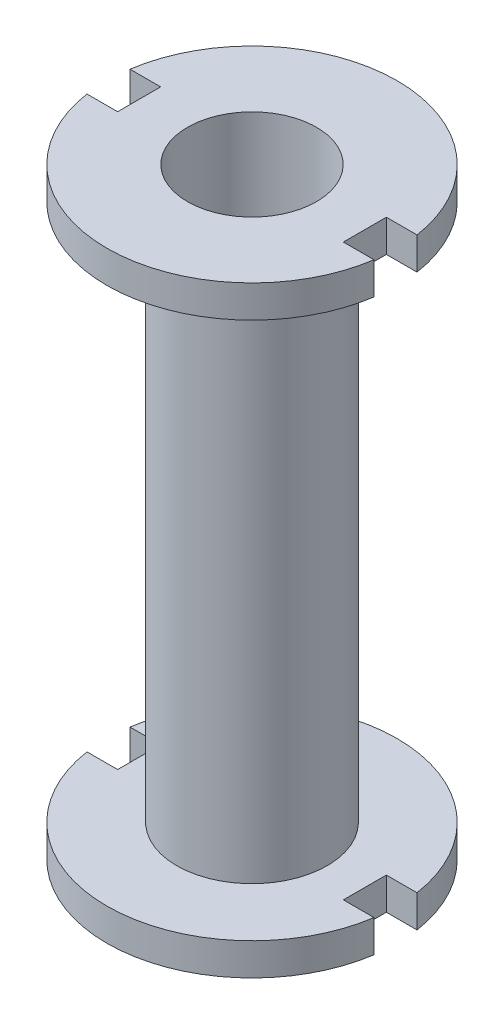
ISO-10303-21;
HEADER;
FILE_DESCRIPTION(('STEP AP214'),'2;1');
FILE_NAME('part.step','',(''),(''),'','','');
FILE_SCHEMA(('AUTOMOTIVE_DESIGN { 1 0 10303 214 1 1 1 1 }'));
ENDSEC;
DATA;
#1=APPLICATION_CONTEXT('core data for automotive mechanical design processes');
#2=APPLICATION_PROTOCOL_DEFINITION('international standard','automotive_design',2000,#1);
#3=PRODUCT_CONTEXT('',#1,'mechanical');
#4=PRODUCT('Part','Part','',(#3));
#5=PRODUCT_RELATED_PRODUCT_CATEGORY('part','',(#4));
#6=PRODUCT_DEFINITION_FORMATION('','',#4);
#7=PRODUCT_DEFINITION_CONTEXT('part definition',#1,'design');
#8=PRODUCT_DEFINITION('design','',#6,#7);
#9=PRODUCT_DEFINITION_SHAPE('','',#8);
#10=(LENGTH_UNIT() NAMED_UNIT(*) SI_UNIT(.MILLI.,.METRE.));
#11=(NAMED_UNIT(*) PLANE_ANGLE_UNIT() SI_UNIT($,.RADIAN.));
#12=(NAMED_UNIT(*) SI_UNIT($,.STERADIAN.) SOLID_ANGLE_UNIT());
#13=UNCERTAINTY_MEASURE_WITH_UNIT(LENGTH_MEASURE(1.E-05),#10,'distance_accuracy_value','');
#14=(GEOMETRIC_REPRESENTATION_CONTEXT(3) GLOBAL_UNCERTAINTY_ASSIGNED_CONTEXT((#13)) GLOBAL_UNIT_ASSIGNED_CONTEXT((#10,
#11,#12)) REPRESENTATION_CONTEXT('',''));
#15=CARTESIAN_POINT('',(0.,0.,0.));
#16=DIRECTION('',(0.,0.,1.));
#17=DIRECTION('',(1.,0.,0.));
#18=AXIS2_PLACEMENT_3D('',#15,#16,#17);
#19=CARTESIAN_POINT('',(0.,14.,0.));
#20=DIRECTION('',(0.,-1.,0.));
#21=DIRECTION('',(0.,0.,-1.));
#22=AXIS2_PLACEMENT_3D('',#19,#20,#21);
#23=CYLINDRICAL_SURFACE('',#22,6.75);
#24=CARTESIAN_POINT('',(0.,-12.5,0.));
#25=DIRECTION('',(0.,1.,0.));
#26=DIRECTION('',(0.,0.,1.));
#27=AXIS2_PLACEMENT_3D('',#24,#25,#26);
#28=CIRCLE('',#27,6.75);
#29=CARTESIAN_POINT('',(-6.67551496140934,-12.5,1.));
#30=VERTEX_POINT('',#29);
#31=CARTESIAN_POINT('',(6.67551496140934,-12.5,1.));
#32=VERTEX_POINT('',#31);
#33=EDGE_CURVE('E265',#30,#32,#28,.T.);
#34=ORIENTED_EDGE('',*,*,#33,.F.);
#35=DIRECTION('',(0.,-1.,0.));
#36=VECTOR('',#35,1.);
#37=CARTESIAN_POINT('',(-6.67551496140934,14.,1.));
#38=LINE('',#37,#36);
#39=CARTESIAN_POINT('',(-6.67551496140934,-14.,1.));
#40=VERTEX_POINT('',#39);
#41=EDGE_CURVE('E236',#30,#40,#38,.T.);
#42=ORIENTED_EDGE('',*,*,#41,.T.);
#43=CARTESIAN_POINT('',(0.,-14.,0.));
#44=DIRECTION('',(0.,1.,0.));
#45=DIRECTION('',(0.,0.,1.));
#46=AXIS2_PLACEMENT_3D('',#43,#44,#45);
#47=CIRCLE('',#46,6.75);
#48=CARTESIAN_POINT('',(6.67551496140934,-14.,1.));
#49=VERTEX_POINT('',#48);
#50=EDGE_CURVE('E250',#40,#49,#47,.T.);
#51=ORIENTED_EDGE('',*,*,#50,.T.);
#52=DIRECTION('',(0.,-1.,0.));
#53=VECTOR('',#52,1.);
#54=CARTESIAN_POINT('',(6.67551496140934,14.,1.));
#55=LINE('',#54,#53);
#56=EDGE_CURVE('E222',#49,#32,#55,.F.);
#57=ORIENTED_EDGE('',*,*,#56,.T.);
#58=EDGE_LOOP('',(#34,#42,#51,#57));
#59=FACE_BOUND('',#58,.T.);
#60=ADVANCED_FACE('F35',(#59),#23,.T.);
#61=CARTESIAN_POINT('',(0.,14.,0.));
#62=DIRECTION('',(0.,1.,0.));
#63=DIRECTION('',(0.,0.,1.));
#64=AXIS2_PLACEMENT_3D('',#61,#62,#63);
#65=CIRCLE('',#64,6.75);
#66=CARTESIAN_POINT('',(-6.67551496140934,14.,1.));
#67=VERTEX_POINT('',#66);
#68=CARTESIAN_POINT('',(6.67551496140934,14.,1.));
#69=VERTEX_POINT('',#68);
#70=EDGE_CURVE('E255',#67,#69,#65,.T.);
#71=ORIENTED_EDGE('',*,*,#70,.F.);
#72=DIRECTION('',(0.,-1.,0.));
#73=VECTOR('',#72,1.);
#74=CARTESIAN_POINT('',(-6.67551496140934,14.,1.));
#75=LINE('',#74,#73);
#76=CARTESIAN_POINT('',(-6.67551496140934,12.5,1.));
#77=VERTEX_POINT('',#76);
#78=EDGE_CURVE('E231',#67,#77,#75,.T.);
#79=ORIENTED_EDGE('',*,*,#78,.T.);
#80=CARTESIAN_POINT('',(0.,12.5,0.));
#81=DIRECTION('',(0.,1.,0.));
#82=DIRECTION('',(0.,0.,1.));
#83=AXIS2_PLACEMENT_3D('',#80,#81,#82);
#84=CIRCLE('',#83,6.75);
#85=CARTESIAN_POINT('',(6.67551496140934,12.5,1.));
#86=VERTEX_POINT('',#85);
#87=EDGE_CURVE('E244',#77,#86,#84,.T.);
#88=ORIENTED_EDGE('',*,*,#87,.T.);
#89=DIRECTION('',(0.,-1.,0.));
#90=VECTOR('',#89,1.);
#91=CARTESIAN_POINT('',(6.67551496140934,14.,1.));
#92=LINE('',#91,#90);
#93=EDGE_CURVE('E217',#86,#69,#92,.F.);
#94=ORIENTED_EDGE('',*,*,#93,.T.);
#95=EDGE_LOOP('',(#71,#79,#88,#94));
#96=FACE_BOUND('',#95,.T.);
#97=ADVANCED_FACE('F315',(#96),#23,.T.);
#98=CARTESIAN_POINT('',(6.67551496140934,-14.,-1.));
#99=VERTEX_POINT('',#98);
#100=CARTESIAN_POINT('',(-6.67551496140934,-14.,-1.));
#101=VERTEX_POINT('',#100);
#102=EDGE_CURVE('E259',#99,#101,#47,.T.);
#103=ORIENTED_EDGE('',*,*,#102,.T.);
#104=DIRECTION('',(0.,-1.,0.));
#105=VECTOR('',#104,1.);
#106=CARTESIAN_POINT('',(-6.67551496140934,14.,-1.));
#107=LINE('',#106,#105);
#108=CARTESIAN_POINT('',(-6.67551496140934,-12.5,-1.));
#109=VERTEX_POINT('',#108);
#110=EDGE_CURVE('E162',#101,#109,#107,.F.);
#111=ORIENTED_EDGE('',*,*,#110,.T.);
#112=CARTESIAN_POINT('',(6.67551496140934,-12.5,-1.));
#113=VERTEX_POINT('',#112);
#114=EDGE_CURVE('E254',#113,#109,#28,.T.);
#115=ORIENTED_EDGE('',*,*,#114,.F.);
#116=DIRECTION('',(0.,-1.,0.));
#117=VECTOR('',#116,1.);
#118=CARTESIAN_POINT('',(6.67551496140934,14.,-1.));
#119=LINE('',#118,#117);
#120=EDGE_CURVE('E58',#113,#99,#119,.T.);
#121=ORIENTED_EDGE('',*,*,#120,.T.);
#122=EDGE_LOOP('',(#103,#111,#115,#121));
#123=FACE_BOUND('',#122,.T.);
#124=ADVANCED_FACE('F317',(#123),#23,.T.);
#125=CARTESIAN_POINT('',(0.,14.,0.));
#126=DIRECTION('',(0.,1.,0.));
#127=DIRECTION('',(0.,0.,1.));
#128=AXIS2_PLACEMENT_3D('',#125,#126,#127);
#129=PLANE('',#128);
#130=DIRECTION('',(1.,0.,0.));
#131=VECTOR('',#130,1.);
#132=CARTESIAN_POINT('',(-8.25,14.,1.));
#133=LINE('',#132,#131);
#134=CARTESIAN_POINT('',(-5.25,14.,1.));
#135=VERTEX_POINT('',#134);
#136=EDGE_CURVE('E171',#67,#135,#133,.T.);
#137=ORIENTED_EDGE('',*,*,#136,.F.);
#138=ORIENTED_EDGE('',*,*,#70,.T.);
#139=DIRECTION('',(1.,0.,0.));
#140=VECTOR('',#139,1.);
#141=CARTESIAN_POINT('',(5.25,14.,1.));
#142=LINE('',#141,#140);
#143=CARTESIAN_POINT('',(5.25,14.,1.));
#144=VERTEX_POINT('',#143);
#145=EDGE_CURVE('E190',#144,#69,#142,.T.);
#146=ORIENTED_EDGE('',*,*,#145,.F.);
#147=DIRECTION('',(0.,0.,1.));
#148=VECTOR('',#147,1.);
#149=CARTESIAN_POINT('',(5.25,14.,-1.));
#150=LINE('',#149,#148);
#151=CARTESIAN_POINT('',(5.25,14.,-1.));
#152=VERTEX_POINT('',#151);
#153=EDGE_CURVE('E200',#152,#144,#150,.T.);
#154=ORIENTED_EDGE('',*,*,#153,.F.);
#155=DIRECTION('',(-1.,0.,0.));
#156=VECTOR('',#155,1.);
#157=CARTESIAN_POINT('',(5.25,14.,-1.));
#158=LINE('',#157,#156);
#159=CARTESIAN_POINT('',(6.67551496140934,14.,-1.));
#160=VERTEX_POINT('',#159);
#161=EDGE_CURVE('E197',#160,#152,#158,.T.);
#162=ORIENTED_EDGE('',*,*,#161,.F.);
#163=CARTESIAN_POINT('',(-6.67551496140934,14.,-1.));
#164=VERTEX_POINT('',#163);
#165=EDGE_CURVE('E258',#160,#164,#65,.T.);
#166=ORIENTED_EDGE('',*,*,#165,.T.);
#167=DIRECTION('',(-1.,0.,0.));
#168=VECTOR('',#167,1.);
#169=CARTESIAN_POINT('',(-8.25,14.,-1.));
#170=LINE('',#169,#168);
#171=CARTESIAN_POINT('',(-5.25,14.,-1.));
#172=VERTEX_POINT('',#171);
#173=EDGE_CURVE('E174',#172,#164,#170,.T.);
#174=ORIENTED_EDGE('',*,*,#173,.F.);
#175=DIRECTION('',(0.,0.,-1.));
#176=VECTOR('',#175,1.);
#177=CARTESIAN_POINT('',(-5.25,14.,-1.));
#178=LINE('',#177,#176);
#179=EDGE_CURVE('E178',#135,#172,#178,.T.);
#180=ORIENTED_EDGE('',*,*,#179,.F.);
#181=EDGE_LOOP('',(#137,#138,#146,#154,#162,#166,#174,#180));
#182=FACE_BOUND('',#181,.T.);
#183=CARTESIAN_POINT('',(0.,14.,0.));
#184=DIRECTION('',(0.,1.,0.));
#185=DIRECTION('',(0.,0.,1.));
#186=AXIS2_PLACEMENT_3D('',#183,#184,#185);
#187=CIRCLE('',#186,3.);
#188=CARTESIAN_POINT('',(0.,14.,3.));
#189=VERTEX_POINT('',#188);
#190=EDGE_CURVE('E247',#189,#189,#187,.T.);
#191=ORIENTED_EDGE('',*,*,#190,.F.);
#192=EDGE_LOOP('',(#191));
#193=FACE_BOUND('',#192,.T.);
#194=ADVANCED_FACE('F296',(#182,#193),#129,.T.);
#195=CARTESIAN_POINT('',(0.,-14.,0.));
#196=DIRECTION('',(0.,1.,0.));
#197=DIRECTION('',(0.,0.,1.));
#198=AXIS2_PLACEMENT_3D('',#195,#196,#197);
#199=PLANE('',#198);
#200=ORIENTED_EDGE('',*,*,#50,.F.);
#201=DIRECTION('',(1.,0.,0.));
#202=VECTOR('',#201,1.);
#203=CARTESIAN_POINT('',(-8.25,-14.,1.));
#204=LINE('',#203,#202);
#205=CARTESIAN_POINT('',(-5.25,-14.,1.));
#206=VERTEX_POINT('',#205);
#207=EDGE_CURVE('E166',#40,#206,#204,.T.);
#208=ORIENTED_EDGE('',*,*,#207,.T.);
#209=DIRECTION('',(0.,0.,-1.));
#210=VECTOR('',#209,1.);
#211=CARTESIAN_POINT('',(-5.25,-14.,-1.));
#212=LINE('',#211,#210);
#213=CARTESIAN_POINT('',(-5.25,-14.,-1.));
#214=VERTEX_POINT('',#213);
#215=EDGE_CURVE('E150',#206,#214,#212,.T.);
#216=ORIENTED_EDGE('',*,*,#215,.T.);
#217=DIRECTION('',(-1.,0.,0.));
#218=VECTOR('',#217,1.);
#219=CARTESIAN_POINT('',(-8.25,-14.,-1.));
#220=LINE('',#219,#218);
#221=EDGE_CURVE('E159',#214,#101,#220,.T.);
#222=ORIENTED_EDGE('',*,*,#221,.T.);
#223=ORIENTED_EDGE('',*,*,#102,.F.);
#224=DIRECTION('',(-1.,0.,0.));
#225=VECTOR('',#224,1.);
#226=CARTESIAN_POINT('',(5.25,-14.,-1.));
#227=LINE('',#226,#225);
#228=CARTESIAN_POINT('',(5.25,-14.,-1.));
#229=VERTEX_POINT('',#228);
#230=EDGE_CURVE('E186',#99,#229,#227,.T.);
#231=ORIENTED_EDGE('',*,*,#230,.T.);
#232=DIRECTION('',(0.,0.,1.));
#233=VECTOR('',#232,1.);
#234=CARTESIAN_POINT('',(5.25,-14.,-1.));
#235=LINE('',#234,#233);
#236=CARTESIAN_POINT('',(5.25,-14.,1.));
#237=VERTEX_POINT('',#236);
#238=EDGE_CURVE('E189',#229,#237,#235,.T.);
#239=ORIENTED_EDGE('',*,*,#238,.T.);
#240=DIRECTION('',(1.,0.,0.));
#241=VECTOR('',#240,1.);
#242=CARTESIAN_POINT('',(5.25,-14.,1.));
#243=LINE('',#242,#241);
#244=EDGE_CURVE('E193',#237,#49,#243,.T.);
#245=ORIENTED_EDGE('',*,*,#244,.T.);
#246=EDGE_LOOP('',(#200,#208,#216,#222,#223,#231,#239,#245));
#247=FACE_BOUND('',#246,.T.);
#248=CARTESIAN_POINT('',(0.,-14.,0.));
#249=DIRECTION('',(0.,1.,0.));
#250=DIRECTION('',(0.,0.,1.));
#251=AXIS2_PLACEMENT_3D('',#248,#249,#250);
#252=CIRCLE('',#251,3.);
#253=CARTESIAN_POINT('',(0.,-14.,3.));
#254=VERTEX_POINT('',#253);
#255=EDGE_CURVE('E251',#254,#254,#252,.T.);
#256=ORIENTED_EDGE('',*,*,#255,.T.);
#257=EDGE_LOOP('',(#256));
#258=FACE_BOUND('',#257,.T.);
#259=ADVANCED_FACE('F169',(#247,#258),#199,.F.);
#260=CARTESIAN_POINT('',(6.67551496140934,12.5,-1.));
#261=VERTEX_POINT('',#260);
#262=CARTESIAN_POINT('',(-6.67551496140934,12.5,-1.));
#263=VERTEX_POINT('',#262);
#264=EDGE_CURVE('E264',#261,#263,#84,.T.);
#265=ORIENTED_EDGE('',*,*,#264,.T.);
#266=DIRECTION('',(0.,-1.,0.));
#267=VECTOR('',#266,1.);
#268=CARTESIAN_POINT('',(-6.67551496140934,14.,-1.));
#269=LINE('',#268,#267);
#270=EDGE_CURVE('E225',#263,#164,#269,.F.);
#271=ORIENTED_EDGE('',*,*,#270,.T.);
#272=ORIENTED_EDGE('',*,*,#165,.F.);
#273=DIRECTION('',(0.,-1.,0.));
#274=VECTOR('',#273,1.);
#275=CARTESIAN_POINT('',(6.67551496140934,14.,-1.));
#276=LINE('',#275,#274);
#277=EDGE_CURVE('E184',#160,#261,#276,.T.);
#278=ORIENTED_EDGE('',*,*,#277,.T.);
#279=EDGE_LOOP('',(#265,#271,#272,#278));
#280=FACE_BOUND('',#279,.T.);
#281=ADVANCED_FACE('F37',(#280),#23,.T.);
#282=CARTESIAN_POINT('',(0.,14.,0.));
#283=DIRECTION('',(0.,-1.,0.));
#284=DIRECTION('',(0.,0.,-1.));
#285=AXIS2_PLACEMENT_3D('',#282,#283,#284);
#286=CYLINDRICAL_SURFACE('',#285,3.);
#287=ORIENTED_EDGE('',*,*,#190,.T.);
#288=EDGE_LOOP('',(#287));
#289=FACE_BOUND('',#288,.T.);
#290=ORIENTED_EDGE('',*,*,#255,.F.);
#291=EDGE_LOOP('',(#290));
#292=FACE_BOUND('',#291,.T.);
#293=ADVANCED_FACE('F328',(#289,#292),#286,.F.);
#294=CARTESIAN_POINT('',(0.,-12.5,0.));
#295=DIRECTION('',(0.,1.,0.));
#296=DIRECTION('',(0.,0.,1.));
#297=AXIS2_PLACEMENT_3D('',#294,#295,#296);
#298=PLANE('',#297);
#299=DIRECTION('',(1.,0.,0.));
#300=VECTOR('',#299,1.);
#301=CARTESIAN_POINT('',(0.,-12.5,1.));
#302=LINE('',#301,#300);
#303=CARTESIAN_POINT('',(-5.25,-12.5,1.));
#304=VERTEX_POINT('',#303);
#305=EDGE_CURVE('E234',#30,#304,#302,.T.);
#306=ORIENTED_EDGE('',*,*,#305,.F.);
#307=ORIENTED_EDGE('',*,*,#33,.T.);
#308=DIRECTION('',(1.,0.,0.));
#309=VECTOR('',#308,1.);
#310=CARTESIAN_POINT('',(0.,-12.5,1.));
#311=LINE('',#310,#309);
#312=CARTESIAN_POINT('',(5.25,-12.5,1.));
#313=VERTEX_POINT('',#312);
#314=EDGE_CURVE('E220',#313,#32,#311,.T.);
#315=ORIENTED_EDGE('',*,*,#314,.F.);
#316=DIRECTION('',(0.,0.,1.));
#317=VECTOR('',#316,1.);
#318=CARTESIAN_POINT('',(5.25,-12.5,0.));
#319=LINE('',#318,#317);
#320=CARTESIAN_POINT('',(5.25,-12.5,-1.));
#321=VERTEX_POINT('',#320);
#322=EDGE_CURVE('E215',#321,#313,#319,.T.);
#323=ORIENTED_EDGE('',*,*,#322,.F.);
#324=DIRECTION('',(-1.,0.,0.));
#325=VECTOR('',#324,1.);
#326=CARTESIAN_POINT('',(0.,-12.5,-1.));
#327=LINE('',#326,#325);
#328=EDGE_CURVE('E212',#113,#321,#327,.T.);
#329=ORIENTED_EDGE('',*,*,#328,.F.);
#330=ORIENTED_EDGE('',*,*,#114,.T.);
#331=DIRECTION('',(-1.,0.,0.));
#332=VECTOR('',#331,1.);
#333=CARTESIAN_POINT('',(0.,-12.5,-1.));
#334=LINE('',#333,#332);
#335=CARTESIAN_POINT('',(-5.25,-12.5,-1.));
#336=VERTEX_POINT('',#335);
#337=EDGE_CURVE('E228',#336,#109,#334,.T.);
#338=ORIENTED_EDGE('',*,*,#337,.F.);
#339=DIRECTION('',(0.,0.,-1.));
#340=VECTOR('',#339,1.);
#341=CARTESIAN_POINT('',(-5.25,-12.5,0.));
#342=LINE('',#341,#340);
#343=EDGE_CURVE('E153',#304,#336,#342,.T.);
#344=ORIENTED_EDGE('',*,*,#343,.F.);
#345=EDGE_LOOP('',(#306,#307,#315,#323,#329,#330,#338,#344));
#346=FACE_BOUND('',#345,.T.);
#347=CARTESIAN_POINT('',(0.,-12.5,0.));
#348=DIRECTION('',(0.,1.,0.));
#349=DIRECTION('',(0.,0.,1.));
#350=AXIS2_PLACEMENT_3D('',#347,#348,#349);
#351=CIRCLE('',#350,3.5);
#352=CARTESIAN_POINT('',(0.,-12.5,3.5));
#353=VERTEX_POINT('',#352);
#354=EDGE_CURVE('E241',#353,#353,#351,.T.);
#355=ORIENTED_EDGE('',*,*,#354,.F.);
#356=EDGE_LOOP('',(#355));
#357=FACE_BOUND('',#356,.T.);
#358=ADVANCED_FACE('F333',(#346,#357),#298,.T.);
#359=CARTESIAN_POINT('',(0.,12.5,0.));
#360=DIRECTION('',(0.,1.,0.));
#361=DIRECTION('',(0.,0.,1.));
#362=AXIS2_PLACEMENT_3D('',#359,#360,#361);
#363=PLANE('',#362);
#364=CARTESIAN_POINT('',(0.,12.5,0.));
#365=DIRECTION('',(0.,1.,0.));
#366=DIRECTION('',(0.,0.,1.));
#367=AXIS2_PLACEMENT_3D('',#364,#365,#366);
#368=CIRCLE('',#367,3.5);
#369=CARTESIAN_POINT('',(0.,12.5,3.5));
#370=VERTEX_POINT('',#369);
#371=EDGE_CURVE('E240',#370,#370,#368,.T.);
#372=ORIENTED_EDGE('',*,*,#371,.T.);
#373=EDGE_LOOP('',(#372));
#374=FACE_BOUND('',#373,.T.);
#375=ORIENTED_EDGE('',*,*,#87,.F.);
#376=DIRECTION('',(1.,0.,0.));
#377=VECTOR('',#376,1.);
#378=CARTESIAN_POINT('',(0.,12.5,1.));
#379=LINE('',#378,#377);
#380=CARTESIAN_POINT('',(-5.25,12.5,1.));
#381=VERTEX_POINT('',#380);
#382=EDGE_CURVE('E11',#77,#381,#379,.T.);
#383=ORIENTED_EDGE('',*,*,#382,.T.);
#384=DIRECTION('',(0.,0.,-1.));
#385=VECTOR('',#384,1.);
#386=CARTESIAN_POINT('',(-5.25,12.5,0.));
#387=LINE('',#386,#385);
#388=CARTESIAN_POINT('',(-5.25,12.5,-1.));
#389=VERTEX_POINT('',#388);
#390=EDGE_CURVE('E43',#381,#389,#387,.T.);
#391=ORIENTED_EDGE('',*,*,#390,.T.);
#392=DIRECTION('',(-1.,0.,0.));
#393=VECTOR('',#392,1.);
#394=CARTESIAN_POINT('',(0.,12.5,-1.));
#395=LINE('',#394,#393);
#396=EDGE_CURVE('E277',#389,#263,#395,.T.);
#397=ORIENTED_EDGE('',*,*,#396,.T.);
#398=ORIENTED_EDGE('',*,*,#264,.F.);
#399=DIRECTION('',(-1.,0.,0.));
#400=VECTOR('',#399,1.);
#401=CARTESIAN_POINT('',(0.,12.5,-1.));
#402=LINE('',#401,#400);
#403=CARTESIAN_POINT('',(5.25,12.5,-1.));
#404=VERTEX_POINT('',#403);
#405=EDGE_CURVE('E268',#261,#404,#402,.T.);
#406=ORIENTED_EDGE('',*,*,#405,.T.);
#407=DIRECTION('',(0.,0.,1.));
#408=VECTOR('',#407,1.);
#409=CARTESIAN_POINT('',(5.25,12.5,0.));
#410=LINE('',#409,#408);
#411=CARTESIAN_POINT('',(5.25,12.5,1.));
#412=VERTEX_POINT('',#411);
#413=EDGE_CURVE('E271',#404,#412,#410,.T.);
#414=ORIENTED_EDGE('',*,*,#413,.T.);
#415=DIRECTION('',(1.,0.,0.));
#416=VECTOR('',#415,1.);
#417=CARTESIAN_POINT('',(0.,12.5,1.));
#418=LINE('',#417,#416);
#419=EDGE_CURVE('E274',#412,#86,#418,.T.);
#420=ORIENTED_EDGE('',*,*,#419,.T.);
#421=EDGE_LOOP('',(#375,#383,#391,#397,#398,#406,#414,#420));
#422=FACE_BOUND('',#421,.T.);
#423=ADVANCED_FACE('F282',(#374,#422),#363,.F.);
#424=CARTESIAN_POINT('',(0.,-12.5,0.));
#425=DIRECTION('',(0.,1.,0.));
#426=DIRECTION('',(0.,0.,1.));
#427=AXIS2_PLACEMENT_3D('',#424,#425,#426);
#428=CYLINDRICAL_SURFACE('',#427,3.5);
#429=ORIENTED_EDGE('',*,*,#354,.T.);
#430=EDGE_LOOP('',(#429));
#431=FACE_BOUND('',#430,.T.);
#432=ORIENTED_EDGE('',*,*,#371,.F.);
#433=EDGE_LOOP('',(#432));
#434=FACE_BOUND('',#433,.T.);
#435=ADVANCED_FACE('F343',(#431,#434),#428,.T.);
#436=CARTESIAN_POINT('',(5.25,-14.,-1.));
#437=DIRECTION('',(0.,0.,-1.));
#438=DIRECTION('',(-1.,0.,0.));
#439=AXIS2_PLACEMENT_3D('',#436,#437,#438);
#440=PLANE('',#439);
#441=ORIENTED_EDGE('',*,*,#161,.T.);
#442=DIRECTION('',(0.,1.,0.));
#443=VECTOR('',#442,1.);
#444=CARTESIAN_POINT('',(5.25,-14.,-1.));
#445=LINE('',#444,#443);
#446=EDGE_CURVE('E196',#404,#152,#445,.T.);
#447=ORIENTED_EDGE('',*,*,#446,.F.);
#448=ORIENTED_EDGE('',*,*,#405,.F.);
#449=ORIENTED_EDGE('',*,*,#277,.F.);
#450=EDGE_LOOP('',(#441,#447,#448,#449));
#451=FACE_BOUND('',#450,.T.);
#452=ADVANCED_FACE('F306',(#451),#440,.F.);
#453=CARTESIAN_POINT('',(5.25,-14.,-1.));
#454=DIRECTION('',(-1.,0.,0.));
#455=DIRECTION('',(0.,0.,1.));
#456=AXIS2_PLACEMENT_3D('',#453,#454,#455);
#457=PLANE('',#456);
#458=ORIENTED_EDGE('',*,*,#446,.T.);
#459=ORIENTED_EDGE('',*,*,#153,.T.);
#460=DIRECTION('',(0.,1.,0.));
#461=VECTOR('',#460,1.);
#462=CARTESIAN_POINT('',(5.25,-14.,1.));
#463=LINE('',#462,#461);
#464=EDGE_CURVE('E206',#412,#144,#463,.T.);
#465=ORIENTED_EDGE('',*,*,#464,.F.);
#466=ORIENTED_EDGE('',*,*,#413,.F.);
#467=EDGE_LOOP('',(#458,#459,#465,#466));
#468=FACE_BOUND('',#467,.T.);
#469=ADVANCED_FACE('F310',(#468),#457,.F.);
#470=CARTESIAN_POINT('',(5.25,-14.,1.));
#471=DIRECTION('',(0.,0.,1.));
#472=DIRECTION('',(1.,0.,0.));
#473=AXIS2_PLACEMENT_3D('',#470,#471,#472);
#474=PLANE('',#473);
#475=ORIENTED_EDGE('',*,*,#419,.F.);
#476=ORIENTED_EDGE('',*,*,#464,.T.);
#477=ORIENTED_EDGE('',*,*,#145,.T.);
#478=ORIENTED_EDGE('',*,*,#93,.F.);
#479=EDGE_LOOP('',(#475,#476,#477,#478));
#480=FACE_BOUND('',#479,.T.);
#481=ADVANCED_FACE('F313',(#480),#474,.F.);
#482=CARTESIAN_POINT('',(-8.25,-14.,-1.));
#483=DIRECTION('',(0.,0.,-1.));
#484=DIRECTION('',(-1.,0.,0.));
#485=AXIS2_PLACEMENT_3D('',#482,#483,#484);
#486=PLANE('',#485);
#487=ORIENTED_EDGE('',*,*,#396,.F.);
#488=DIRECTION('',(0.,1.,0.));
#489=VECTOR('',#488,1.);
#490=CARTESIAN_POINT('',(-5.25,-14.,-1.));
#491=LINE('',#490,#489);
#492=EDGE_CURVE('E156',#389,#172,#491,.T.);
#493=ORIENTED_EDGE('',*,*,#492,.T.);
#494=ORIENTED_EDGE('',*,*,#173,.T.);
#495=ORIENTED_EDGE('',*,*,#270,.F.);
#496=EDGE_LOOP('',(#487,#493,#494,#495));
#497=FACE_BOUND('',#496,.T.);
#498=ADVANCED_FACE('F302',(#497),#486,.F.);
#499=CARTESIAN_POINT('',(-8.25,-14.,1.));
#500=DIRECTION('',(0.,0.,1.));
#501=DIRECTION('',(1.,0.,0.));
#502=AXIS2_PLACEMENT_3D('',#499,#500,#501);
#503=PLANE('',#502);
#504=ORIENTED_EDGE('',*,*,#136,.T.);
#505=DIRECTION('',(0.,1.,0.));
#506=VECTOR('',#505,1.);
#507=CARTESIAN_POINT('',(-5.25,-14.,1.));
#508=LINE('',#507,#506);
#509=EDGE_CURVE('E155',#381,#135,#508,.T.);
#510=ORIENTED_EDGE('',*,*,#509,.F.);
#511=ORIENTED_EDGE('',*,*,#382,.F.);
#512=ORIENTED_EDGE('',*,*,#78,.F.);
#513=EDGE_LOOP('',(#504,#510,#511,#512));
#514=FACE_BOUND('',#513,.T.);
#515=ADVANCED_FACE('F290',(#514),#503,.F.);
#516=CARTESIAN_POINT('',(-5.25,-14.,-1.));
#517=DIRECTION('',(1.,0.,0.));
#518=DIRECTION('',(0.,0.,-1.));
#519=AXIS2_PLACEMENT_3D('',#516,#517,#518);
#520=PLANE('',#519);
#521=ORIENTED_EDGE('',*,*,#509,.T.);
#522=ORIENTED_EDGE('',*,*,#179,.T.);
#523=ORIENTED_EDGE('',*,*,#492,.F.);
#524=ORIENTED_EDGE('',*,*,#390,.F.);
#525=EDGE_LOOP('',(#521,#522,#523,#524));
#526=FACE_BOUND('',#525,.T.);
#527=ADVANCED_FACE('F288',(#526),#520,.F.);
#528=ORIENTED_EDGE('',*,*,#244,.F.);
#529=EDGE_CURVE('E181',#237,#313,#463,.T.);
#530=ORIENTED_EDGE('',*,*,#529,.T.);
#531=ORIENTED_EDGE('',*,*,#314,.T.);
#532=ORIENTED_EDGE('',*,*,#56,.F.);
#533=EDGE_LOOP('',(#528,#530,#531,#532));
#534=FACE_BOUND('',#533,.T.);
#535=ADVANCED_FACE('F355',(#534),#474,.F.);
#536=ORIENTED_EDGE('',*,*,#328,.T.);
#537=EDGE_CURVE('E207',#229,#321,#445,.T.);
#538=ORIENTED_EDGE('',*,*,#537,.F.);
#539=ORIENTED_EDGE('',*,*,#230,.F.);
#540=ORIENTED_EDGE('',*,*,#120,.F.);
#541=EDGE_LOOP('',(#536,#538,#539,#540));
#542=FACE_BOUND('',#541,.T.);
#543=ADVANCED_FACE('F351',(#542),#440,.F.);
#544=ORIENTED_EDGE('',*,*,#322,.T.);
#545=ORIENTED_EDGE('',*,*,#529,.F.);
#546=ORIENTED_EDGE('',*,*,#238,.F.);
#547=ORIENTED_EDGE('',*,*,#537,.T.);
#548=EDGE_LOOP('',(#544,#545,#546,#547));
#549=FACE_BOUND('',#548,.T.);
#550=ADVANCED_FACE('F354',(#549),#457,.F.);
#551=ORIENTED_EDGE('',*,*,#305,.T.);
#552=EDGE_CURVE('E183',#206,#304,#508,.T.);
#553=ORIENTED_EDGE('',*,*,#552,.F.);
#554=ORIENTED_EDGE('',*,*,#207,.F.);
#555=ORIENTED_EDGE('',*,*,#41,.F.);
#556=EDGE_LOOP('',(#551,#553,#554,#555));
#557=FACE_BOUND('',#556,.T.);
#558=ADVANCED_FACE('F358',(#557),#503,.F.);
#559=ORIENTED_EDGE('',*,*,#221,.F.);
#560=EDGE_CURVE('E50',#214,#336,#491,.T.);
#561=ORIENTED_EDGE('',*,*,#560,.T.);
#562=ORIENTED_EDGE('',*,*,#337,.T.);
#563=ORIENTED_EDGE('',*,*,#110,.F.);
#564=EDGE_LOOP('',(#559,#561,#562,#563));
#565=FACE_BOUND('',#564,.T.);
#566=ADVANCED_FACE('F160',(#565),#486,.F.);
#567=ORIENTED_EDGE('',*,*,#343,.T.);
#568=ORIENTED_EDGE('',*,*,#560,.F.);
#569=ORIENTED_EDGE('',*,*,#215,.F.);
#570=ORIENTED_EDGE('',*,*,#552,.T.);
#571=EDGE_LOOP('',(#567,#568,#569,#570));
#572=FACE_BOUND('',#571,.T.);
#573=ADVANCED_FACE('F147',(#572),#520,.F.);
#574=CLOSED_SHELL('',(#60,#97,#124,#194,#259,#281,#293,#358,#423,#435,#452,#469,#481,#498,#515,
#527,#535,#543,#550,#558,#566,#573));
#575=MANIFOLD_SOLID_BREP('B2',#574);
#576=ADVANCED_BREP_SHAPE_REPRESENTATION('',(#18,#575),#14);
#577=SHAPE_DEFINITION_REPRESENTATION(#9,#576);
ENDSEC;
END-ISO-10303-21;
